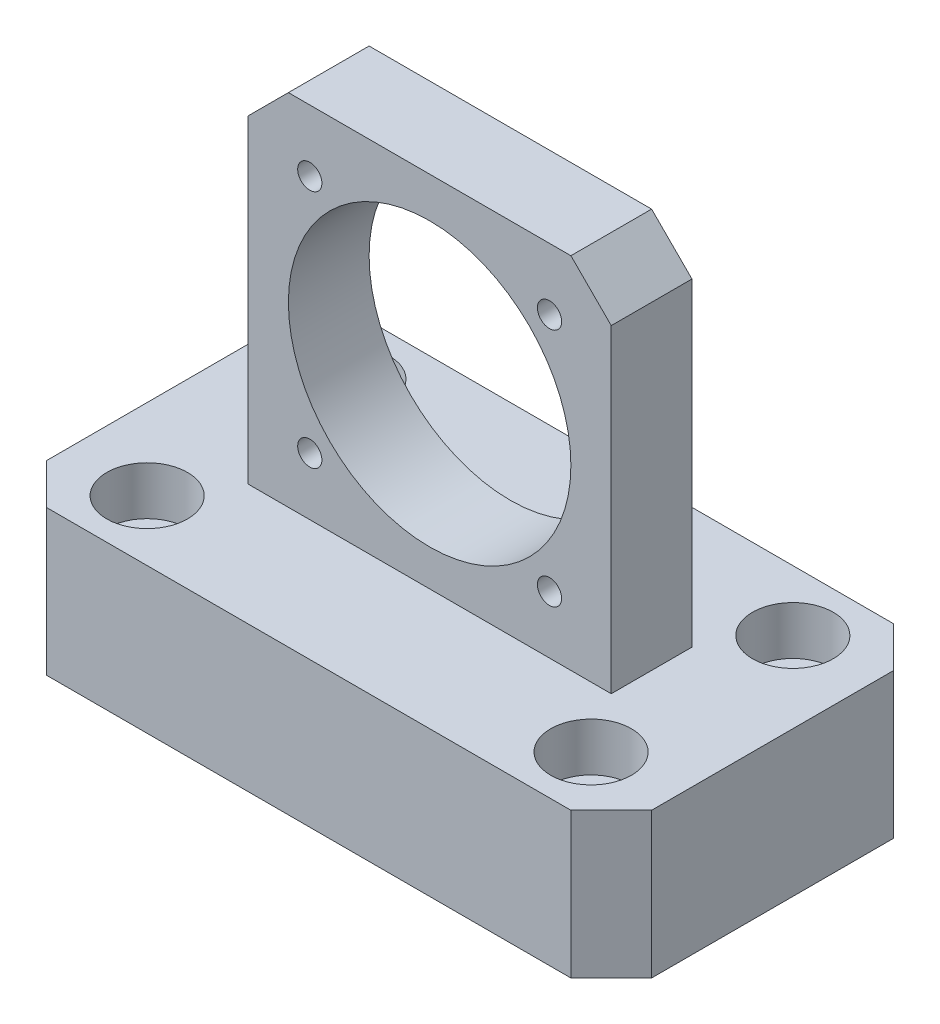
ISO-10303-21;
HEADER;
FILE_DESCRIPTION(('STEP AP214'),'2;1');
FILE_NAME('part.step','',(''),(''),'','','');
FILE_SCHEMA(('AUTOMOTIVE_DESIGN { 1 0 10303 214 1 1 1 1 }'));
ENDSEC;
DATA;
#1=APPLICATION_CONTEXT('core data for automotive mechanical design processes');
#2=APPLICATION_PROTOCOL_DEFINITION('international standard','automotive_design',2000,#1);
#3=PRODUCT_CONTEXT('',#1,'mechanical');
#4=PRODUCT('Part','Part','',(#3));
#5=PRODUCT_RELATED_PRODUCT_CATEGORY('part','',(#4));
#6=PRODUCT_DEFINITION_FORMATION('','',#4);
#7=PRODUCT_DEFINITION_CONTEXT('part definition',#1,'design');
#8=PRODUCT_DEFINITION('design','',#6,#7);
#9=PRODUCT_DEFINITION_SHAPE('','',#8);
#10=(LENGTH_UNIT() NAMED_UNIT(*) SI_UNIT(.MILLI.,.METRE.));
#11=(NAMED_UNIT(*) PLANE_ANGLE_UNIT() SI_UNIT($,.RADIAN.));
#12=(NAMED_UNIT(*) SI_UNIT($,.STERADIAN.) SOLID_ANGLE_UNIT());
#13=UNCERTAINTY_MEASURE_WITH_UNIT(LENGTH_MEASURE(1.E-05),#10,'distance_accuracy_value','');
#14=(GEOMETRIC_REPRESENTATION_CONTEXT(3) GLOBAL_UNCERTAINTY_ASSIGNED_CONTEXT((#13)) GLOBAL_UNIT_ASSIGNED_CONTEXT((#10,
#11,#12)) REPRESENTATION_CONTEXT('',''));
#15=CARTESIAN_POINT('',(0.,0.,0.));
#16=DIRECTION('',(0.,0.,1.));
#17=DIRECTION('',(1.,0.,0.));
#18=AXIS2_PLACEMENT_3D('',#15,#16,#17);
#19=CARTESIAN_POINT('',(0.,18.,0.));
#20=DIRECTION('',(0.,-1.,0.));
#21=DIRECTION('',(0.,0.,-1.));
#22=AXIS2_PLACEMENT_3D('',#19,#20,#21);
#23=PLANE('',#22);
#24=CARTESIAN_POINT('',(65.,18.,-32.5));
#25=DIRECTION('',(0.,1.,0.));
#26=DIRECTION('',(0.,0.,1.));
#27=AXIS2_PLACEMENT_3D('',#24,#25,#26);
#28=CIRCLE('',#27,5.00000000000001);
#29=CARTESIAN_POINT('',(65.,18.,-27.5));
#30=VERTEX_POINT('',#29);
#31=EDGE_CURVE('E570',#30,#30,#28,.T.);
#32=ORIENTED_EDGE('',*,*,#31,.F.);
#33=EDGE_LOOP('',(#32));
#34=FACE_BOUND('',#33,.T.);
#35=CARTESIAN_POINT('',(65.,18.,-7.5));
#36=DIRECTION('',(0.,1.,0.));
#37=DIRECTION('',(0.,0.,1.));
#38=AXIS2_PLACEMENT_3D('',#35,#36,#37);
#39=CIRCLE('',#38,5.);
#40=CARTESIAN_POINT('',(65.,18.,-2.5));
#41=VERTEX_POINT('',#40);
#42=EDGE_CURVE('E562',#41,#41,#39,.T.);
#43=ORIENTED_EDGE('',*,*,#42,.F.);
#44=EDGE_LOOP('',(#43));
#45=FACE_BOUND('',#44,.T.);
#46=CARTESIAN_POINT('',(10.,18.,-7.5));
#47=DIRECTION('',(0.,1.,0.));
#48=DIRECTION('',(0.,0.,1.));
#49=AXIS2_PLACEMENT_3D('',#46,#47,#48);
#50=CIRCLE('',#49,5.);
#51=CARTESIAN_POINT('',(10.,18.,-2.5));
#52=VERTEX_POINT('',#51);
#53=EDGE_CURVE('E553',#52,#52,#50,.T.);
#54=ORIENTED_EDGE('',*,*,#53,.F.);
#55=EDGE_LOOP('',(#54));
#56=FACE_BOUND('',#55,.T.);
#57=CARTESIAN_POINT('',(10.,18.,-32.5));
#58=DIRECTION('',(0.,1.,0.));
#59=DIRECTION('',(0.,0.,1.));
#60=AXIS2_PLACEMENT_3D('',#57,#58,#59);
#61=CIRCLE('',#60,5.);
#62=CARTESIAN_POINT('',(10.,18.,-27.5));
#63=VERTEX_POINT('',#62);
#64=EDGE_CURVE('E557',#63,#63,#61,.T.);
#65=ORIENTED_EDGE('',*,*,#64,.F.);
#66=EDGE_LOOP('',(#65));
#67=FACE_BOUND('',#66,.T.);
#68=DIRECTION('',(-1.,0.,0.));
#69=VECTOR('',#68,1.);
#70=CARTESIAN_POINT('',(0.,18.,-40.));
#71=LINE('',#70,#69);
#72=CARTESIAN_POINT('',(70.,18.,-40.));
#73=VERTEX_POINT('',#72);
#74=CARTESIAN_POINT('',(5.00000000000002,18.,-40.));
#75=VERTEX_POINT('',#74);
#76=EDGE_CURVE('E209',#73,#75,#71,.T.);
#77=ORIENTED_EDGE('',*,*,#76,.T.);
#78=DIRECTION('',(0.70710678118655,0.,-0.707106781186546));
#79=VECTOR('',#78,1.);
#80=CARTESIAN_POINT('',(0.,18.,-35.));
#81=LINE('',#80,#79);
#82=CARTESIAN_POINT('',(0.,18.,-35.));
#83=VERTEX_POINT('',#82);
#84=EDGE_CURVE('E262',#75,#83,#81,.F.);
#85=ORIENTED_EDGE('',*,*,#84,.T.);
#86=DIRECTION('',(0.,0.,1.));
#87=VECTOR('',#86,1.);
#88=CARTESIAN_POINT('',(0.,18.,0.));
#89=LINE('',#88,#87);
#90=CARTESIAN_POINT('',(0.,18.,-5.00000000000002));
#91=VERTEX_POINT('',#90);
#92=EDGE_CURVE('E196',#83,#91,#89,.T.);
#93=ORIENTED_EDGE('',*,*,#92,.T.);
#94=DIRECTION('',(-0.707106781186546,0.,-0.70710678118655));
#95=VECTOR('',#94,1.);
#96=CARTESIAN_POINT('',(5.,18.,0.));
#97=LINE('',#96,#95);
#98=CARTESIAN_POINT('',(5.,18.,0.));
#99=VERTEX_POINT('',#98);
#100=EDGE_CURVE('E256',#91,#99,#97,.F.);
#101=ORIENTED_EDGE('',*,*,#100,.T.);
#102=DIRECTION('',(1.,0.,0.));
#103=VECTOR('',#102,1.);
#104=CARTESIAN_POINT('',(0.,18.,0.));
#105=LINE('',#104,#103);
#106=CARTESIAN_POINT('',(70.,18.,0.));
#107=VERTEX_POINT('',#106);
#108=EDGE_CURVE('E200',#99,#107,#105,.T.);
#109=ORIENTED_EDGE('',*,*,#108,.T.);
#110=DIRECTION('',(-0.707106781186549,0.,0.707106781186546));
#111=VECTOR('',#110,1.);
#112=CARTESIAN_POINT('',(75.,18.,-5.));
#113=LINE('',#112,#111);
#114=CARTESIAN_POINT('',(75.,18.,-5.));
#115=VERTEX_POINT('',#114);
#116=EDGE_CURVE('E253',#107,#115,#113,.F.);
#117=ORIENTED_EDGE('',*,*,#116,.T.);
#118=DIRECTION('',(0.,0.,-1.));
#119=VECTOR('',#118,1.);
#120=CARTESIAN_POINT('',(75.,18.,0.));
#121=LINE('',#120,#119);
#122=CARTESIAN_POINT('',(75.,18.,-35.));
#123=VERTEX_POINT('',#122);
#124=EDGE_CURVE('E205',#115,#123,#121,.T.);
#125=ORIENTED_EDGE('',*,*,#124,.T.);
#126=DIRECTION('',(0.707106781186547,0.,0.707106781186549));
#127=VECTOR('',#126,1.);
#128=CARTESIAN_POINT('',(70.,18.,-40.));
#129=LINE('',#128,#127);
#130=EDGE_CURVE('E259',#123,#73,#129,.F.);
#131=ORIENTED_EDGE('',*,*,#130,.T.);
#132=EDGE_LOOP('',(#77,#85,#93,#101,#109,#117,#125,#131));
#133=FACE_BOUND('',#132,.T.);
#134=DIRECTION('',(0.,0.,1.));
#135=VECTOR('',#134,1.);
#136=CARTESIAN_POINT('',(15.,18.,-25.));
#137=LINE('',#136,#135);
#138=CARTESIAN_POINT('',(15.,18.,-25.));
#139=VERTEX_POINT('',#138);
#140=CARTESIAN_POINT('',(15.,18.,-15.));
#141=VERTEX_POINT('',#140);
#142=EDGE_CURVE('E177',#139,#141,#137,.T.);
#143=ORIENTED_EDGE('',*,*,#142,.F.);
#144=DIRECTION('',(-1.,0.,0.));
#145=VECTOR('',#144,1.);
#146=CARTESIAN_POINT('',(15.,18.,-25.));
#147=LINE('',#146,#145);
#148=CARTESIAN_POINT('',(60.,18.,-25.));
#149=VERTEX_POINT('',#148);
#150=EDGE_CURVE('E171',#149,#139,#147,.T.);
#151=ORIENTED_EDGE('',*,*,#150,.F.);
#152=DIRECTION('',(0.,0.,-1.));
#153=VECTOR('',#152,1.);
#154=CARTESIAN_POINT('',(60.,18.,-25.));
#155=LINE('',#154,#153);
#156=CARTESIAN_POINT('',(60.,18.,-15.));
#157=VERTEX_POINT('',#156);
#158=EDGE_CURVE('E155',#157,#149,#155,.T.);
#159=ORIENTED_EDGE('',*,*,#158,.F.);
#160=DIRECTION('',(1.,0.,0.));
#161=VECTOR('',#160,1.);
#162=CARTESIAN_POINT('',(15.,18.,-15.));
#163=LINE('',#162,#161);
#164=EDGE_CURVE('E168',#141,#157,#163,.T.);
#165=ORIENTED_EDGE('',*,*,#164,.F.);
#166=EDGE_LOOP('',(#143,#151,#159,#165));
#167=FACE_BOUND('',#166,.T.);
#168=ADVANCED_FACE('F47',(#34,#45,#56,#67,#133,#167),#23,.F.);
#169=CARTESIAN_POINT('',(0.,18.,0.));
#170=DIRECTION('',(1.,0.,0.));
#171=DIRECTION('',(0.,0.,-1.));
#172=AXIS2_PLACEMENT_3D('',#169,#170,#171);
#173=PLANE('',#172);
#174=ORIENTED_EDGE('',*,*,#92,.F.);
#175=DIRECTION('',(0.,-1.,0.));
#176=VECTOR('',#175,1.);
#177=CARTESIAN_POINT('',(0.,18.,-35.));
#178=LINE('',#177,#176);
#179=CARTESIAN_POINT('',(0.,0.,-35.));
#180=VERTEX_POINT('',#179);
#181=EDGE_CURVE('E230',#83,#180,#178,.T.);
#182=ORIENTED_EDGE('',*,*,#181,.T.);
#183=DIRECTION('',(0.,0.,1.));
#184=VECTOR('',#183,1.);
#185=CARTESIAN_POINT('',(0.,0.,0.));
#186=LINE('',#185,#184);
#187=CARTESIAN_POINT('',(0.,0.,-5.00000000000002));
#188=VERTEX_POINT('',#187);
#189=EDGE_CURVE('E195',#180,#188,#186,.T.);
#190=ORIENTED_EDGE('',*,*,#189,.T.);
#191=DIRECTION('',(0.,1.,0.));
#192=VECTOR('',#191,1.);
#193=CARTESIAN_POINT('',(0.,18.,-5.00000000000002));
#194=LINE('',#193,#192);
#195=EDGE_CURVE('E213',#188,#91,#194,.T.);
#196=ORIENTED_EDGE('',*,*,#195,.T.);
#197=EDGE_LOOP('',(#174,#182,#190,#196));
#198=FACE_BOUND('',#197,.T.);
#199=ADVANCED_FACE('F351',(#198),#173,.F.);
#200=CARTESIAN_POINT('',(0.,18.,0.));
#201=DIRECTION('',(0.,0.,-1.));
#202=DIRECTION('',(-1.,0.,0.));
#203=AXIS2_PLACEMENT_3D('',#200,#201,#202);
#204=PLANE('',#203);
#205=ORIENTED_EDGE('',*,*,#108,.F.);
#206=DIRECTION('',(0.,-1.,0.));
#207=VECTOR('',#206,1.);
#208=CARTESIAN_POINT('',(5.,18.,0.));
#209=LINE('',#208,#207);
#210=CARTESIAN_POINT('',(5.,0.,0.));
#211=VERTEX_POINT('',#210);
#212=EDGE_CURVE('E275',#99,#211,#209,.T.);
#213=ORIENTED_EDGE('',*,*,#212,.T.);
#214=DIRECTION('',(1.,0.,0.));
#215=VECTOR('',#214,1.);
#216=CARTESIAN_POINT('',(0.,0.,0.));
#217=LINE('',#216,#215);
#218=CARTESIAN_POINT('',(70.,0.,0.));
#219=VERTEX_POINT('',#218);
#220=EDGE_CURVE('E217',#211,#219,#217,.T.);
#221=ORIENTED_EDGE('',*,*,#220,.T.);
#222=DIRECTION('',(0.,1.,0.));
#223=VECTOR('',#222,1.);
#224=CARTESIAN_POINT('',(70.,18.,0.));
#225=LINE('',#224,#223);
#226=EDGE_CURVE('E272',#219,#107,#225,.T.);
#227=ORIENTED_EDGE('',*,*,#226,.T.);
#228=EDGE_LOOP('',(#205,#213,#221,#227));
#229=FACE_BOUND('',#228,.T.);
#230=ADVANCED_FACE('F359',(#229),#204,.F.);
#231=CARTESIAN_POINT('',(75.,18.,0.));
#232=DIRECTION('',(-1.,0.,0.));
#233=DIRECTION('',(0.,0.,1.));
#234=AXIS2_PLACEMENT_3D('',#231,#232,#233);
#235=PLANE('',#234);
#236=DIRECTION('',(0.,0.,-1.));
#237=VECTOR('',#236,1.);
#238=CARTESIAN_POINT('',(75.,0.,0.));
#239=LINE('',#238,#237);
#240=CARTESIAN_POINT('',(75.,0.,-5.));
#241=VERTEX_POINT('',#240);
#242=CARTESIAN_POINT('',(75.,0.,-35.));
#243=VERTEX_POINT('',#242);
#244=EDGE_CURVE('E221',#241,#243,#239,.T.);
#245=ORIENTED_EDGE('',*,*,#244,.T.);
#246=DIRECTION('',(0.,1.,0.));
#247=VECTOR('',#246,1.);
#248=CARTESIAN_POINT('',(75.,18.,-35.));
#249=LINE('',#248,#247);
#250=EDGE_CURVE('E269',#243,#123,#249,.T.);
#251=ORIENTED_EDGE('',*,*,#250,.T.);
#252=ORIENTED_EDGE('',*,*,#124,.F.);
#253=DIRECTION('',(0.,-1.,0.));
#254=VECTOR('',#253,1.);
#255=CARTESIAN_POINT('',(75.,18.,-5.));
#256=LINE('',#255,#254);
#257=EDGE_CURVE('E265',#115,#241,#256,.T.);
#258=ORIENTED_EDGE('',*,*,#257,.T.);
#259=EDGE_LOOP('',(#245,#251,#252,#258));
#260=FACE_BOUND('',#259,.T.);
#261=ADVANCED_FACE('F375',(#260),#235,.F.);
#262=CARTESIAN_POINT('',(0.,18.,-40.));
#263=DIRECTION('',(0.,0.,1.));
#264=DIRECTION('',(1.,0.,0.));
#265=AXIS2_PLACEMENT_3D('',#262,#263,#264);
#266=PLANE('',#265);
#267=DIRECTION('',(-1.,0.,0.));
#268=VECTOR('',#267,1.);
#269=CARTESIAN_POINT('',(0.,0.,-40.));
#270=LINE('',#269,#268);
#271=CARTESIAN_POINT('',(70.,0.,-40.));
#272=VERTEX_POINT('',#271);
#273=CARTESIAN_POINT('',(5.00000000000002,0.,-40.));
#274=VERTEX_POINT('',#273);
#275=EDGE_CURVE('E201',#272,#274,#270,.T.);
#276=ORIENTED_EDGE('',*,*,#275,.T.);
#277=DIRECTION('',(0.,1.,0.));
#278=VECTOR('',#277,1.);
#279=CARTESIAN_POINT('',(5.00000000000002,18.,-40.));
#280=LINE('',#279,#278);
#281=EDGE_CURVE('E250',#274,#75,#280,.T.);
#282=ORIENTED_EDGE('',*,*,#281,.T.);
#283=ORIENTED_EDGE('',*,*,#76,.F.);
#284=DIRECTION('',(0.,-1.,0.));
#285=VECTOR('',#284,1.);
#286=CARTESIAN_POINT('',(70.,18.,-40.));
#287=LINE('',#286,#285);
#288=EDGE_CURVE('E246',#73,#272,#287,.T.);
#289=ORIENTED_EDGE('',*,*,#288,.T.);
#290=EDGE_LOOP('',(#276,#282,#283,#289));
#291=FACE_BOUND('',#290,.T.);
#292=ADVANCED_FACE('F371',(#291),#266,.F.);
#293=CARTESIAN_POINT('',(0.,0.,0.));
#294=DIRECTION('',(0.,-1.,0.));
#295=DIRECTION('',(0.,0.,-1.));
#296=AXIS2_PLACEMENT_3D('',#293,#294,#295);
#297=PLANE('',#296);
#298=CARTESIAN_POINT('',(65.,0.,-7.5));
#299=DIRECTION('',(0.,1.,0.));
#300=DIRECTION('',(0.,0.,1.));
#301=AXIS2_PLACEMENT_3D('',#298,#299,#300);
#302=CIRCLE('',#301,2.75000000000001);
#303=CARTESIAN_POINT('',(65.,0.,-4.74999999999999));
#304=VERTEX_POINT('',#303);
#305=EDGE_CURVE('E545',#304,#304,#302,.T.);
#306=ORIENTED_EDGE('',*,*,#305,.T.);
#307=EDGE_LOOP('',(#306));
#308=FACE_BOUND('',#307,.T.);
#309=CARTESIAN_POINT('',(65.,0.,-32.5));
#310=DIRECTION('',(0.,1.,0.));
#311=DIRECTION('',(0.,0.,1.));
#312=AXIS2_PLACEMENT_3D('',#309,#310,#311);
#313=CIRCLE('',#312,2.75000000000001);
#314=CARTESIAN_POINT('',(65.,0.,-29.75));
#315=VERTEX_POINT('',#314);
#316=EDGE_CURVE('E537',#315,#315,#313,.T.);
#317=ORIENTED_EDGE('',*,*,#316,.T.);
#318=EDGE_LOOP('',(#317));
#319=FACE_BOUND('',#318,.T.);
#320=CARTESIAN_POINT('',(10.,0.,-32.5));
#321=DIRECTION('',(0.,1.,0.));
#322=DIRECTION('',(0.,0.,1.));
#323=AXIS2_PLACEMENT_3D('',#320,#321,#322);
#324=CIRCLE('',#323,2.75);
#325=CARTESIAN_POINT('',(10.,0.,-29.75));
#326=VERTEX_POINT('',#325);
#327=EDGE_CURVE('E519',#326,#326,#324,.T.);
#328=ORIENTED_EDGE('',*,*,#327,.T.);
#329=EDGE_LOOP('',(#328));
#330=FACE_BOUND('',#329,.T.);
#331=CARTESIAN_POINT('',(10.,0.,-7.5));
#332=DIRECTION('',(0.,1.,0.));
#333=DIRECTION('',(0.,0.,1.));
#334=AXIS2_PLACEMENT_3D('',#331,#332,#333);
#335=CIRCLE('',#334,2.75);
#336=CARTESIAN_POINT('',(10.,0.,-4.75));
#337=VERTEX_POINT('',#336);
#338=EDGE_CURVE('E529',#337,#337,#335,.T.);
#339=ORIENTED_EDGE('',*,*,#338,.T.);
#340=EDGE_LOOP('',(#339));
#341=FACE_BOUND('',#340,.T.);
#342=ORIENTED_EDGE('',*,*,#189,.F.);
#343=DIRECTION('',(-0.70710678118655,0.,0.707106781186546));
#344=VECTOR('',#343,1.);
#345=CARTESIAN_POINT('',(-17.5,0.,-17.5000000000001));
#346=LINE('',#345,#344);
#347=EDGE_CURVE('E243',#180,#274,#346,.F.);
#348=ORIENTED_EDGE('',*,*,#347,.T.);
#349=ORIENTED_EDGE('',*,*,#275,.F.);
#350=DIRECTION('',(-0.707106781186547,0.,-0.707106781186549));
#351=VECTOR('',#350,1.);
#352=CARTESIAN_POINT('',(55.0000000000001,0.,-54.9999999999999));
#353=LINE('',#352,#351);
#354=EDGE_CURVE('E240',#272,#243,#353,.F.);
#355=ORIENTED_EDGE('',*,*,#354,.T.);
#356=ORIENTED_EDGE('',*,*,#244,.F.);
#357=DIRECTION('',(0.707106781186549,0.,-0.707106781186546));
#358=VECTOR('',#357,1.);
#359=CARTESIAN_POINT('',(34.9999999999998,0.,35.));
#360=LINE('',#359,#358);
#361=EDGE_CURVE('E234',#241,#219,#360,.F.);
#362=ORIENTED_EDGE('',*,*,#361,.T.);
#363=ORIENTED_EDGE('',*,*,#220,.F.);
#364=DIRECTION('',(0.707106781186546,0.,0.70710678118655));
#365=VECTOR('',#364,1.);
#366=CARTESIAN_POINT('',(2.50000000000001,0.,-2.5));
#367=LINE('',#366,#365);
#368=EDGE_CURVE('E237',#211,#188,#367,.F.);
#369=ORIENTED_EDGE('',*,*,#368,.T.);
#370=EDGE_LOOP('',(#342,#348,#349,#355,#356,#362,#363,#369));
#371=FACE_BOUND('',#370,.T.);
#372=ADVANCED_FACE('F367',(#308,#319,#330,#341,#371),#297,.T.);
#373=CARTESIAN_POINT('',(0.,18.,-35.));
#374=DIRECTION('',(0.707106781186546,0.,0.70710678118655));
#375=DIRECTION('',(0.,-1.,0.));
#376=AXIS2_PLACEMENT_3D('',#373,#374,#375);
#377=PLANE('',#376);
#378=ORIENTED_EDGE('',*,*,#84,.F.);
#379=ORIENTED_EDGE('',*,*,#281,.F.);
#380=ORIENTED_EDGE('',*,*,#347,.F.);
#381=ORIENTED_EDGE('',*,*,#181,.F.);
#382=EDGE_LOOP('',(#378,#379,#380,#381));
#383=FACE_BOUND('',#382,.T.);
#384=ADVANCED_FACE('F370',(#383),#377,.F.);
#385=CARTESIAN_POINT('',(70.,18.,-40.));
#386=DIRECTION('',(-0.707106781186549,0.,0.707106781186547));
#387=DIRECTION('',(0.,-1.,0.));
#388=AXIS2_PLACEMENT_3D('',#385,#386,#387);
#389=PLANE('',#388);
#390=ORIENTED_EDGE('',*,*,#130,.F.);
#391=ORIENTED_EDGE('',*,*,#250,.F.);
#392=ORIENTED_EDGE('',*,*,#354,.F.);
#393=ORIENTED_EDGE('',*,*,#288,.F.);
#394=EDGE_LOOP('',(#390,#391,#392,#393));
#395=FACE_BOUND('',#394,.T.);
#396=ADVANCED_FACE('F389',(#395),#389,.F.);
#397=CARTESIAN_POINT('',(5.,18.,0.));
#398=DIRECTION('',(0.70710678118655,0.,-0.707106781186546));
#399=DIRECTION('',(0.,-1.,0.));
#400=AXIS2_PLACEMENT_3D('',#397,#398,#399);
#401=PLANE('',#400);
#402=ORIENTED_EDGE('',*,*,#100,.F.);
#403=ORIENTED_EDGE('',*,*,#195,.F.);
#404=ORIENTED_EDGE('',*,*,#368,.F.);
#405=ORIENTED_EDGE('',*,*,#212,.F.);
#406=EDGE_LOOP('',(#402,#403,#404,#405));
#407=FACE_BOUND('',#406,.T.);
#408=ADVANCED_FACE('F396',(#407),#401,.F.);
#409=CARTESIAN_POINT('',(75.,18.,-5.));
#410=DIRECTION('',(-0.707106781186546,0.,-0.707106781186549));
#411=DIRECTION('',(0.,-1.,0.));
#412=AXIS2_PLACEMENT_3D('',#409,#410,#411);
#413=PLANE('',#412);
#414=ORIENTED_EDGE('',*,*,#116,.F.);
#415=ORIENTED_EDGE('',*,*,#226,.F.);
#416=ORIENTED_EDGE('',*,*,#361,.F.);
#417=ORIENTED_EDGE('',*,*,#257,.F.);
#418=EDGE_LOOP('',(#414,#415,#416,#417));
#419=FACE_BOUND('',#418,.T.);
#420=ADVANCED_FACE('F403',(#419),#413,.F.);
#421=CARTESIAN_POINT('',(15.,62.5,-25.));
#422=DIRECTION('',(1.,0.,0.));
#423=DIRECTION('',(0.,0.,-1.));
#424=AXIS2_PLACEMENT_3D('',#421,#422,#423);
#425=PLANE('',#424);
#426=DIRECTION('',(0.,-1.,0.));
#427=VECTOR('',#426,1.);
#428=CARTESIAN_POINT('',(15.,62.5,-15.));
#429=LINE('',#428,#427);
#430=CARTESIAN_POINT('',(15.,57.5,-15.));
#431=VERTEX_POINT('',#430);
#432=EDGE_CURVE('E161',#431,#141,#429,.T.);
#433=ORIENTED_EDGE('',*,*,#432,.F.);
#434=DIRECTION('',(0.,0.,-1.));
#435=VECTOR('',#434,1.);
#436=CARTESIAN_POINT('',(15.,57.5,-25.));
#437=LINE('',#436,#435);
#438=CARTESIAN_POINT('',(15.,57.5,-25.));
#439=VERTEX_POINT('',#438);
#440=EDGE_CURVE('E74',#431,#439,#437,.T.);
#441=ORIENTED_EDGE('',*,*,#440,.T.);
#442=DIRECTION('',(0.,-1.,0.));
#443=VECTOR('',#442,1.);
#444=CARTESIAN_POINT('',(15.,62.5,-25.));
#445=LINE('',#444,#443);
#446=EDGE_CURVE('E187',#439,#139,#445,.T.);
#447=ORIENTED_EDGE('',*,*,#446,.T.);
#448=ORIENTED_EDGE('',*,*,#142,.T.);
#449=EDGE_LOOP('',(#433,#441,#447,#448));
#450=FACE_BOUND('',#449,.T.);
#451=ADVANCED_FACE('F339',(#450),#425,.F.);
#452=CARTESIAN_POINT('',(15.,62.5,-15.));
#453=DIRECTION('',(0.,0.,-1.));
#454=DIRECTION('',(-1.,0.,0.));
#455=AXIS2_PLACEMENT_3D('',#452,#453,#454);
#456=PLANE('',#455);
#457=CARTESIAN_POINT('',(22.65,25.15,-15.));
#458=DIRECTION('',(0.,0.,1.));
#459=DIRECTION('',(1.,0.,0.));
#460=AXIS2_PLACEMENT_3D('',#457,#458,#459);
#461=CIRCLE('',#460,1.5);
#462=CARTESIAN_POINT('',(24.15,25.15,-15.));
#463=VERTEX_POINT('',#462);
#464=EDGE_CURVE('E581',#463,#463,#461,.T.);
#465=ORIENTED_EDGE('',*,*,#464,.F.);
#466=EDGE_LOOP('',(#465));
#467=FACE_BOUND('',#466,.T.);
#468=CARTESIAN_POINT('',(52.35,25.15,-15.));
#469=DIRECTION('',(0.,0.,1.));
#470=DIRECTION('',(1.,0.,0.));
#471=AXIS2_PLACEMENT_3D('',#468,#469,#470);
#472=CIRCLE('',#471,1.5);
#473=CARTESIAN_POINT('',(53.85,25.15,-15.));
#474=VERTEX_POINT('',#473);
#475=EDGE_CURVE('E589',#474,#474,#472,.T.);
#476=ORIENTED_EDGE('',*,*,#475,.F.);
#477=EDGE_LOOP('',(#476));
#478=FACE_BOUND('',#477,.T.);
#479=CARTESIAN_POINT('',(52.35,54.85,-15.));
#480=DIRECTION('',(0.,0.,1.));
#481=DIRECTION('',(1.,0.,0.));
#482=AXIS2_PLACEMENT_3D('',#479,#480,#481);
#483=CIRCLE('',#482,1.5);
#484=CARTESIAN_POINT('',(53.85,54.85,-15.));
#485=VERTEX_POINT('',#484);
#486=EDGE_CURVE('E585',#485,#485,#483,.T.);
#487=ORIENTED_EDGE('',*,*,#486,.F.);
#488=EDGE_LOOP('',(#487));
#489=FACE_BOUND('',#488,.T.);
#490=CARTESIAN_POINT('',(22.65,54.85,-15.));
#491=DIRECTION('',(0.,0.,1.));
#492=DIRECTION('',(1.,0.,0.));
#493=AXIS2_PLACEMENT_3D('',#490,#491,#492);
#494=CIRCLE('',#493,1.5);
#495=CARTESIAN_POINT('',(24.15,54.85,-15.));
#496=VERTEX_POINT('',#495);
#497=EDGE_CURVE('E308',#496,#496,#494,.T.);
#498=ORIENTED_EDGE('',*,*,#497,.F.);
#499=EDGE_LOOP('',(#498));
#500=FACE_BOUND('',#499,.T.);
#501=CARTESIAN_POINT('',(37.5,40.,-15.));
#502=DIRECTION('',(0.,0.,1.));
#503=DIRECTION('',(1.,0.,0.));
#504=AXIS2_PLACEMENT_3D('',#501,#502,#503);
#505=CIRCLE('',#504,17.5);
#506=CARTESIAN_POINT('',(55.,40.,-15.));
#507=VERTEX_POINT('',#506);
#508=EDGE_CURVE('E302',#507,#507,#505,.T.);
#509=ORIENTED_EDGE('',*,*,#508,.F.);
#510=EDGE_LOOP('',(#509));
#511=FACE_BOUND('',#510,.T.);
#512=DIRECTION('',(1.,0.,0.));
#513=VECTOR('',#512,1.);
#514=CARTESIAN_POINT('',(15.,62.5,-15.));
#515=LINE('',#514,#513);
#516=CARTESIAN_POINT('',(20.,62.5,-15.));
#517=VERTEX_POINT('',#516);
#518=CARTESIAN_POINT('',(55.,62.5,-15.));
#519=VERTEX_POINT('',#518);
#520=EDGE_CURVE('E186',#517,#519,#515,.T.);
#521=ORIENTED_EDGE('',*,*,#520,.F.);
#522=DIRECTION('',(-0.707106781186546,-0.707106781186549,0.));
#523=VECTOR('',#522,1.);
#524=CARTESIAN_POINT('',(20.,62.5,-15.));
#525=LINE('',#524,#523);
#526=EDGE_CURVE('E290',#517,#431,#525,.T.);
#527=ORIENTED_EDGE('',*,*,#526,.T.);
#528=ORIENTED_EDGE('',*,*,#432,.T.);
#529=ORIENTED_EDGE('',*,*,#164,.T.);
#530=DIRECTION('',(0.,-1.,0.));
#531=VECTOR('',#530,1.);
#532=CARTESIAN_POINT('',(60.,62.5,-15.));
#533=LINE('',#532,#531);
#534=CARTESIAN_POINT('',(60.,57.5,-15.));
#535=VERTEX_POINT('',#534);
#536=EDGE_CURVE('E152',#535,#157,#533,.T.);
#537=ORIENTED_EDGE('',*,*,#536,.F.);
#538=DIRECTION('',(-0.707106781186546,0.707106781186549,0.));
#539=VECTOR('',#538,1.);
#540=CARTESIAN_POINT('',(55.,62.5,-15.));
#541=LINE('',#540,#539);
#542=EDGE_CURVE('E287',#535,#519,#541,.T.);
#543=ORIENTED_EDGE('',*,*,#542,.T.);
#544=EDGE_LOOP('',(#521,#527,#528,#529,#537,#543));
#545=FACE_BOUND('',#544,.T.);
#546=ADVANCED_FACE('F175',(#467,#478,#489,#500,#511,#545),#456,.F.);
#547=CARTESIAN_POINT('',(60.,62.5,-25.));
#548=DIRECTION('',(-1.,0.,0.));
#549=DIRECTION('',(0.,0.,1.));
#550=AXIS2_PLACEMENT_3D('',#547,#548,#549);
#551=PLANE('',#550);
#552=DIRECTION('',(0.,-1.,0.));
#553=VECTOR('',#552,1.);
#554=CARTESIAN_POINT('',(60.,62.5,-25.));
#555=LINE('',#554,#553);
#556=CARTESIAN_POINT('',(60.,57.5,-25.));
#557=VERTEX_POINT('',#556);
#558=EDGE_CURVE('E162',#557,#149,#555,.T.);
#559=ORIENTED_EDGE('',*,*,#558,.F.);
#560=DIRECTION('',(0.,0.,1.));
#561=VECTOR('',#560,1.);
#562=CARTESIAN_POINT('',(60.,57.5,-15.));
#563=LINE('',#562,#561);
#564=EDGE_CURVE('E11',#557,#535,#563,.T.);
#565=ORIENTED_EDGE('',*,*,#564,.T.);
#566=ORIENTED_EDGE('',*,*,#536,.T.);
#567=ORIENTED_EDGE('',*,*,#158,.T.);
#568=EDGE_LOOP('',(#559,#565,#566,#567));
#569=FACE_BOUND('',#568,.T.);
#570=ADVANCED_FACE('F154',(#569),#551,.F.);
#571=CARTESIAN_POINT('',(15.,62.5,-25.));
#572=DIRECTION('',(0.,0.,1.));
#573=DIRECTION('',(1.,0.,0.));
#574=AXIS2_PLACEMENT_3D('',#571,#572,#573);
#575=PLANE('',#574);
#576=CARTESIAN_POINT('',(22.65,25.15,-25.));
#577=DIRECTION('',(0.,0.,1.));
#578=DIRECTION('',(1.,0.,0.));
#579=AXIS2_PLACEMENT_3D('',#576,#577,#578);
#580=CIRCLE('',#579,1.5);
#581=CARTESIAN_POINT('',(24.15,25.15,-25.));
#582=VERTEX_POINT('',#581);
#583=EDGE_CURVE('E52',#582,#582,#580,.T.);
#584=ORIENTED_EDGE('',*,*,#583,.T.);
#585=EDGE_LOOP('',(#584));
#586=FACE_BOUND('',#585,.T.);
#587=CARTESIAN_POINT('',(52.35,25.15,-25.));
#588=DIRECTION('',(0.,0.,1.));
#589=DIRECTION('',(1.,0.,0.));
#590=AXIS2_PLACEMENT_3D('',#587,#588,#589);
#591=CIRCLE('',#590,1.5);
#592=CARTESIAN_POINT('',(53.85,25.15,-25.));
#593=VERTEX_POINT('',#592);
#594=EDGE_CURVE('E311',#593,#593,#591,.T.);
#595=ORIENTED_EDGE('',*,*,#594,.T.);
#596=EDGE_LOOP('',(#595));
#597=FACE_BOUND('',#596,.T.);
#598=CARTESIAN_POINT('',(52.35,54.85,-25.));
#599=DIRECTION('',(0.,0.,1.));
#600=DIRECTION('',(1.,0.,0.));
#601=AXIS2_PLACEMENT_3D('',#598,#599,#600);
#602=CIRCLE('',#601,1.5);
#603=CARTESIAN_POINT('',(53.85,54.85,-25.));
#604=VERTEX_POINT('',#603);
#605=EDGE_CURVE('E307',#604,#604,#602,.T.);
#606=ORIENTED_EDGE('',*,*,#605,.T.);
#607=EDGE_LOOP('',(#606));
#608=FACE_BOUND('',#607,.T.);
#609=CARTESIAN_POINT('',(22.65,54.85,-25.));
#610=DIRECTION('',(0.,0.,1.));
#611=DIRECTION('',(1.,0.,0.));
#612=AXIS2_PLACEMENT_3D('',#609,#610,#611);
#613=CIRCLE('',#612,1.5);
#614=CARTESIAN_POINT('',(24.15,54.85,-25.));
#615=VERTEX_POINT('',#614);
#616=EDGE_CURVE('E303',#615,#615,#613,.T.);
#617=ORIENTED_EDGE('',*,*,#616,.T.);
#618=EDGE_LOOP('',(#617));
#619=FACE_BOUND('',#618,.T.);
#620=CARTESIAN_POINT('',(37.5,40.,-25.));
#621=DIRECTION('',(0.,0.,1.));
#622=DIRECTION('',(1.,0.,0.));
#623=AXIS2_PLACEMENT_3D('',#620,#621,#622);
#624=CIRCLE('',#623,17.5);
#625=CARTESIAN_POINT('',(55.,40.,-25.));
#626=VERTEX_POINT('',#625);
#627=EDGE_CURVE('E180',#626,#626,#624,.T.);
#628=ORIENTED_EDGE('',*,*,#627,.T.);
#629=EDGE_LOOP('',(#628));
#630=FACE_BOUND('',#629,.T.);
#631=ORIENTED_EDGE('',*,*,#446,.F.);
#632=DIRECTION('',(0.707106781186546,0.707106781186549,0.));
#633=VECTOR('',#632,1.);
#634=CARTESIAN_POINT('',(20.,62.5,-25.));
#635=LINE('',#634,#633);
#636=CARTESIAN_POINT('',(20.,62.5,-25.));
#637=VERTEX_POINT('',#636);
#638=EDGE_CURVE('E58',#439,#637,#635,.T.);
#639=ORIENTED_EDGE('',*,*,#638,.T.);
#640=DIRECTION('',(-1.,0.,0.));
#641=VECTOR('',#640,1.);
#642=CARTESIAN_POINT('',(15.,62.5,-25.));
#643=LINE('',#642,#641);
#644=CARTESIAN_POINT('',(55.,62.5,-25.));
#645=VERTEX_POINT('',#644);
#646=EDGE_CURVE('E190',#645,#637,#643,.T.);
#647=ORIENTED_EDGE('',*,*,#646,.F.);
#648=DIRECTION('',(0.707106781186546,-0.707106781186549,0.));
#649=VECTOR('',#648,1.);
#650=CARTESIAN_POINT('',(55.,62.5,-25.));
#651=LINE('',#650,#649);
#652=EDGE_CURVE('E66',#645,#557,#651,.T.);
#653=ORIENTED_EDGE('',*,*,#652,.T.);
#654=ORIENTED_EDGE('',*,*,#558,.T.);
#655=ORIENTED_EDGE('',*,*,#150,.T.);
#656=EDGE_LOOP('',(#631,#639,#647,#653,#654,#655));
#657=FACE_BOUND('',#656,.T.);
#658=ADVANCED_FACE('F340',(#586,#597,#608,#619,#630,#657),#575,.F.);
#659=CARTESIAN_POINT('',(0.,62.5,0.));
#660=DIRECTION('',(0.,1.,0.));
#661=DIRECTION('',(0.,0.,1.));
#662=AXIS2_PLACEMENT_3D('',#659,#660,#661);
#663=PLANE('',#662);
#664=ORIENTED_EDGE('',*,*,#646,.T.);
#665=DIRECTION('',(0.,0.,1.));
#666=VECTOR('',#665,1.);
#667=CARTESIAN_POINT('',(20.,62.5,-15.));
#668=LINE('',#667,#666);
#669=EDGE_CURVE('E283',#637,#517,#668,.T.);
#670=ORIENTED_EDGE('',*,*,#669,.T.);
#671=ORIENTED_EDGE('',*,*,#520,.T.);
#672=DIRECTION('',(0.,0.,-1.));
#673=VECTOR('',#672,1.);
#674=CARTESIAN_POINT('',(55.,62.5,-25.));
#675=LINE('',#674,#673);
#676=EDGE_CURVE('E279',#519,#645,#675,.T.);
#677=ORIENTED_EDGE('',*,*,#676,.T.);
#678=EDGE_LOOP('',(#664,#670,#671,#677));
#679=FACE_BOUND('',#678,.T.);
#680=ADVANCED_FACE('F334',(#679),#663,.T.);
#681=CARTESIAN_POINT('',(20.,62.5,0.));
#682=DIRECTION('',(-0.707106781186549,0.707106781186546,0.));
#683=DIRECTION('',(0.,0.,-1.));
#684=AXIS2_PLACEMENT_3D('',#681,#682,#683);
#685=PLANE('',#684);
#686=ORIENTED_EDGE('',*,*,#638,.F.);
#687=ORIENTED_EDGE('',*,*,#440,.F.);
#688=ORIENTED_EDGE('',*,*,#526,.F.);
#689=ORIENTED_EDGE('',*,*,#669,.F.);
#690=EDGE_LOOP('',(#686,#687,#688,#689));
#691=FACE_BOUND('',#690,.T.);
#692=ADVANCED_FACE('F338',(#691),#685,.T.);
#693=CARTESIAN_POINT('',(55.,62.5,0.));
#694=DIRECTION('',(0.707106781186549,0.707106781186546,0.));
#695=DIRECTION('',(0.,0.,1.));
#696=AXIS2_PLACEMENT_3D('',#693,#694,#695);
#697=PLANE('',#696);
#698=ORIENTED_EDGE('',*,*,#542,.F.);
#699=ORIENTED_EDGE('',*,*,#564,.F.);
#700=ORIENTED_EDGE('',*,*,#652,.F.);
#701=ORIENTED_EDGE('',*,*,#676,.F.);
#702=EDGE_LOOP('',(#698,#699,#700,#701));
#703=FACE_BOUND('',#702,.T.);
#704=ADVANCED_FACE('F50',(#703),#697,.T.);
#705=CARTESIAN_POINT('',(37.5,40.,-40.));
#706=DIRECTION('',(0.,0.,1.));
#707=DIRECTION('',(1.,0.,0.));
#708=AXIS2_PLACEMENT_3D('',#705,#706,#707);
#709=CYLINDRICAL_SURFACE('',#708,17.5);
#710=ORIENTED_EDGE('',*,*,#508,.T.);
#711=EDGE_LOOP('',(#710));
#712=FACE_BOUND('',#711,.T.);
#713=ORIENTED_EDGE('',*,*,#627,.F.);
#714=EDGE_LOOP('',(#713));
#715=FACE_BOUND('',#714,.T.);
#716=ADVANCED_FACE('F343',(#712,#715),#709,.F.);
#717=CARTESIAN_POINT('',(22.65,54.85,-40.));
#718=DIRECTION('',(0.,0.,1.));
#719=DIRECTION('',(1.,0.,0.));
#720=AXIS2_PLACEMENT_3D('',#717,#718,#719);
#721=CYLINDRICAL_SURFACE('',#720,1.5);
#722=ORIENTED_EDGE('',*,*,#497,.T.);
#723=EDGE_LOOP('',(#722));
#724=FACE_BOUND('',#723,.T.);
#725=ORIENTED_EDGE('',*,*,#616,.F.);
#726=EDGE_LOOP('',(#725));
#727=FACE_BOUND('',#726,.T.);
#728=ADVANCED_FACE('F348',(#724,#727),#721,.F.);
#729=CARTESIAN_POINT('',(52.35,54.85,-40.));
#730=DIRECTION('',(0.,0.,1.));
#731=DIRECTION('',(1.,0.,0.));
#732=AXIS2_PLACEMENT_3D('',#729,#730,#731);
#733=CYLINDRICAL_SURFACE('',#732,1.5);
#734=ORIENTED_EDGE('',*,*,#486,.T.);
#735=EDGE_LOOP('',(#734));
#736=FACE_BOUND('',#735,.T.);
#737=ORIENTED_EDGE('',*,*,#605,.F.);
#738=EDGE_LOOP('',(#737));
#739=FACE_BOUND('',#738,.T.);
#740=ADVANCED_FACE('F456',(#736,#739),#733,.F.);
#741=CARTESIAN_POINT('',(52.35,25.15,-40.));
#742=DIRECTION('',(0.,0.,1.));
#743=DIRECTION('',(1.,0.,0.));
#744=AXIS2_PLACEMENT_3D('',#741,#742,#743);
#745=CYLINDRICAL_SURFACE('',#744,1.5);
#746=ORIENTED_EDGE('',*,*,#475,.T.);
#747=EDGE_LOOP('',(#746));
#748=FACE_BOUND('',#747,.T.);
#749=ORIENTED_EDGE('',*,*,#594,.F.);
#750=EDGE_LOOP('',(#749));
#751=FACE_BOUND('',#750,.T.);
#752=ADVANCED_FACE('F461',(#748,#751),#745,.F.);
#753=CARTESIAN_POINT('',(22.65,25.15,-40.));
#754=DIRECTION('',(0.,0.,1.));
#755=DIRECTION('',(1.,0.,0.));
#756=AXIS2_PLACEMENT_3D('',#753,#754,#755);
#757=CYLINDRICAL_SURFACE('',#756,1.5);
#758=ORIENTED_EDGE('',*,*,#464,.T.);
#759=EDGE_LOOP('',(#758));
#760=FACE_BOUND('',#759,.T.);
#761=ORIENTED_EDGE('',*,*,#583,.F.);
#762=EDGE_LOOP('',(#761));
#763=FACE_BOUND('',#762,.T.);
#764=ADVANCED_FACE('F458',(#760,#763),#757,.F.);
#765=CARTESIAN_POINT('',(10.,12.,-32.5));
#766=DIRECTION('',(0.,1.,0.));
#767=DIRECTION('',(0.,0.,1.));
#768=AXIS2_PLACEMENT_3D('',#765,#766,#767);
#769=CYLINDRICAL_SURFACE('',#768,5.);
#770=CARTESIAN_POINT('',(10.,12.,-32.5));
#771=DIRECTION('',(0.,1.,0.));
#772=DIRECTION('',(0.,0.,1.));
#773=AXIS2_PLACEMENT_3D('',#770,#771,#772);
#774=CIRCLE('',#773,5.);
#775=CARTESIAN_POINT('',(10.,12.,-27.5));
#776=VERTEX_POINT('',#775);
#777=EDGE_CURVE('E577',#776,#776,#774,.T.);
#778=ORIENTED_EDGE('',*,*,#777,.F.);
#779=EDGE_LOOP('',(#778));
#780=FACE_BOUND('',#779,.T.);
#781=ORIENTED_EDGE('',*,*,#64,.T.);
#782=EDGE_LOOP('',(#781));
#783=FACE_BOUND('',#782,.T.);
#784=ADVANCED_FACE('F460',(#780,#783),#769,.F.);
#785=CARTESIAN_POINT('',(10.,12.,-32.5));
#786=DIRECTION('',(0.,1.,0.));
#787=DIRECTION('',(0.,0.,1.));
#788=AXIS2_PLACEMENT_3D('',#785,#786,#787);
#789=PLANE('',#788);
#790=CARTESIAN_POINT('',(10.,12.,-32.5));
#791=DIRECTION('',(0.,1.,0.));
#792=DIRECTION('',(0.,0.,1.));
#793=AXIS2_PLACEMENT_3D('',#790,#791,#792);
#794=CIRCLE('',#793,2.75);
#795=CARTESIAN_POINT('',(10.,12.,-29.75));
#796=VERTEX_POINT('',#795);
#797=EDGE_CURVE('E522',#796,#796,#794,.T.);
#798=ORIENTED_EDGE('',*,*,#797,.F.);
#799=EDGE_LOOP('',(#798));
#800=FACE_BOUND('',#799,.T.);
#801=ORIENTED_EDGE('',*,*,#777,.T.);
#802=EDGE_LOOP('',(#801));
#803=FACE_BOUND('',#802,.T.);
#804=ADVANCED_FACE('F470',(#800,#803),#789,.T.);
#805=CARTESIAN_POINT('',(10.,12.,-7.5));
#806=DIRECTION('',(0.,1.,0.));
#807=DIRECTION('',(0.,0.,1.));
#808=AXIS2_PLACEMENT_3D('',#805,#806,#807);
#809=CYLINDRICAL_SURFACE('',#808,5.);
#810=CARTESIAN_POINT('',(10.,12.,-7.5));
#811=DIRECTION('',(0.,1.,0.));
#812=DIRECTION('',(0.,0.,1.));
#813=AXIS2_PLACEMENT_3D('',#810,#811,#812);
#814=CIRCLE('',#813,5.);
#815=CARTESIAN_POINT('',(10.,12.,-2.5));
#816=VERTEX_POINT('',#815);
#817=EDGE_CURVE('E558',#816,#816,#814,.T.);
#818=ORIENTED_EDGE('',*,*,#817,.F.);
#819=EDGE_LOOP('',(#818));
#820=FACE_BOUND('',#819,.T.);
#821=ORIENTED_EDGE('',*,*,#53,.T.);
#822=EDGE_LOOP('',(#821));
#823=FACE_BOUND('',#822,.T.);
#824=ADVANCED_FACE('F474',(#820,#823),#809,.F.);
#825=CARTESIAN_POINT('',(10.,12.,-7.5));
#826=DIRECTION('',(0.,1.,0.));
#827=DIRECTION('',(0.,0.,1.));
#828=AXIS2_PLACEMENT_3D('',#825,#826,#827);
#829=PLANE('',#828);
#830=CARTESIAN_POINT('',(10.,12.,-7.5));
#831=DIRECTION('',(0.,1.,0.));
#832=DIRECTION('',(0.,0.,1.));
#833=AXIS2_PLACEMENT_3D('',#830,#831,#832);
#834=CIRCLE('',#833,2.75);
#835=CARTESIAN_POINT('',(10.,12.,-4.75));
#836=VERTEX_POINT('',#835);
#837=EDGE_CURVE('E524',#836,#836,#834,.T.);
#838=ORIENTED_EDGE('',*,*,#837,.F.);
#839=EDGE_LOOP('',(#838));
#840=FACE_BOUND('',#839,.T.);
#841=ORIENTED_EDGE('',*,*,#817,.T.);
#842=EDGE_LOOP('',(#841));
#843=FACE_BOUND('',#842,.T.);
#844=ADVANCED_FACE('F492',(#840,#843),#829,.T.);
#845=CARTESIAN_POINT('',(65.,12.,-7.5));
#846=DIRECTION('',(0.,1.,0.));
#847=DIRECTION('',(0.,0.,1.));
#848=AXIS2_PLACEMENT_3D('',#845,#846,#847);
#849=CYLINDRICAL_SURFACE('',#848,5.);
#850=CARTESIAN_POINT('',(65.,12.,-7.5));
#851=DIRECTION('',(0.,1.,0.));
#852=DIRECTION('',(0.,0.,1.));
#853=AXIS2_PLACEMENT_3D('',#850,#851,#852);
#854=CIRCLE('',#853,5.);
#855=CARTESIAN_POINT('',(65.,12.,-2.5));
#856=VERTEX_POINT('',#855);
#857=EDGE_CURVE('E566',#856,#856,#854,.T.);
#858=ORIENTED_EDGE('',*,*,#857,.F.);
#859=EDGE_LOOP('',(#858));
#860=FACE_BOUND('',#859,.T.);
#861=ORIENTED_EDGE('',*,*,#42,.T.);
#862=EDGE_LOOP('',(#861));
#863=FACE_BOUND('',#862,.T.);
#864=ADVANCED_FACE('F488',(#860,#863),#849,.F.);
#865=CARTESIAN_POINT('',(65.,12.,-7.5));
#866=DIRECTION('',(0.,1.,0.));
#867=DIRECTION('',(0.,0.,1.));
#868=AXIS2_PLACEMENT_3D('',#865,#866,#867);
#869=PLANE('',#868);
#870=CARTESIAN_POINT('',(65.,12.,-7.5));
#871=DIRECTION('',(0.,1.,0.));
#872=DIRECTION('',(0.,0.,1.));
#873=AXIS2_PLACEMENT_3D('',#870,#871,#872);
#874=CIRCLE('',#873,2.75000000000001);
#875=CARTESIAN_POINT('',(65.,12.,-4.74999999999999));
#876=VERTEX_POINT('',#875);
#877=EDGE_CURVE('E541',#876,#876,#874,.T.);
#878=ORIENTED_EDGE('',*,*,#877,.F.);
#879=EDGE_LOOP('',(#878));
#880=FACE_BOUND('',#879,.T.);
#881=ORIENTED_EDGE('',*,*,#857,.T.);
#882=EDGE_LOOP('',(#881));
#883=FACE_BOUND('',#882,.T.);
#884=ADVANCED_FACE('F484',(#880,#883),#869,.T.);
#885=CARTESIAN_POINT('',(65.,12.,-32.5));
#886=DIRECTION('',(0.,1.,0.));
#887=DIRECTION('',(0.,0.,1.));
#888=AXIS2_PLACEMENT_3D('',#885,#886,#887);
#889=CYLINDRICAL_SURFACE('',#888,5.00000000000001);
#890=CARTESIAN_POINT('',(65.,12.,-32.5));
#891=DIRECTION('',(0.,1.,0.));
#892=DIRECTION('',(0.,0.,1.));
#893=AXIS2_PLACEMENT_3D('',#890,#891,#892);
#894=CIRCLE('',#893,5.00000000000001);
#895=CARTESIAN_POINT('',(65.,12.,-27.5));
#896=VERTEX_POINT('',#895);
#897=EDGE_CURVE('E551',#896,#896,#894,.T.);
#898=ORIENTED_EDGE('',*,*,#897,.F.);
#899=EDGE_LOOP('',(#898));
#900=FACE_BOUND('',#899,.T.);
#901=ORIENTED_EDGE('',*,*,#31,.T.);
#902=EDGE_LOOP('',(#901));
#903=FACE_BOUND('',#902,.T.);
#904=ADVANCED_FACE('F480',(#900,#903),#889,.F.);
#905=CARTESIAN_POINT('',(65.,12.,-32.5));
#906=DIRECTION('',(0.,1.,0.));
#907=DIRECTION('',(0.,0.,1.));
#908=AXIS2_PLACEMENT_3D('',#905,#906,#907);
#909=PLANE('',#908);
#910=CARTESIAN_POINT('',(65.,12.,-32.5));
#911=DIRECTION('',(0.,1.,0.));
#912=DIRECTION('',(0.,0.,1.));
#913=AXIS2_PLACEMENT_3D('',#910,#911,#912);
#914=CIRCLE('',#913,2.75000000000001);
#915=CARTESIAN_POINT('',(65.,12.,-29.75));
#916=VERTEX_POINT('',#915);
#917=EDGE_CURVE('E531',#916,#916,#914,.T.);
#918=ORIENTED_EDGE('',*,*,#917,.F.);
#919=EDGE_LOOP('',(#918));
#920=FACE_BOUND('',#919,.T.);
#921=ORIENTED_EDGE('',*,*,#897,.T.);
#922=EDGE_LOOP('',(#921));
#923=FACE_BOUND('',#922,.T.);
#924=ADVANCED_FACE('F476',(#920,#923),#909,.T.);
#925=CARTESIAN_POINT('',(10.,0.,-7.5));
#926=DIRECTION('',(0.,1.,0.));
#927=DIRECTION('',(0.,0.,1.));
#928=AXIS2_PLACEMENT_3D('',#925,#926,#927);
#929=CYLINDRICAL_SURFACE('',#928,2.75);
#930=ORIENTED_EDGE('',*,*,#338,.F.);
#931=EDGE_LOOP('',(#930));
#932=FACE_BOUND('',#931,.T.);
#933=ORIENTED_EDGE('',*,*,#837,.T.);
#934=EDGE_LOOP('',(#933));
#935=FACE_BOUND('',#934,.T.);
#936=ADVANCED_FACE('F479',(#932,#935),#929,.F.);
#937=CARTESIAN_POINT('',(10.,0.,-32.5));
#938=DIRECTION('',(0.,1.,0.));
#939=DIRECTION('',(0.,0.,1.));
#940=AXIS2_PLACEMENT_3D('',#937,#938,#939);
#941=CYLINDRICAL_SURFACE('',#940,2.75);
#942=ORIENTED_EDGE('',*,*,#327,.F.);
#943=EDGE_LOOP('',(#942));
#944=FACE_BOUND('',#943,.T.);
#945=ORIENTED_EDGE('',*,*,#797,.T.);
#946=EDGE_LOOP('',(#945));
#947=FACE_BOUND('',#946,.T.);
#948=ADVANCED_FACE('F502',(#944,#947),#941,.F.);
#949=CARTESIAN_POINT('',(65.,0.,-32.5));
#950=DIRECTION('',(0.,1.,0.));
#951=DIRECTION('',(0.,0.,1.));
#952=AXIS2_PLACEMENT_3D('',#949,#950,#951);
#953=CYLINDRICAL_SURFACE('',#952,2.75000000000001);
#954=ORIENTED_EDGE('',*,*,#316,.F.);
#955=EDGE_LOOP('',(#954));
#956=FACE_BOUND('',#955,.T.);
#957=ORIENTED_EDGE('',*,*,#917,.T.);
#958=EDGE_LOOP('',(#957));
#959=FACE_BOUND('',#958,.T.);
#960=ADVANCED_FACE('F507',(#956,#959),#953,.F.);
#961=CARTESIAN_POINT('',(65.,0.,-7.5));
#962=DIRECTION('',(0.,1.,0.));
#963=DIRECTION('',(0.,0.,1.));
#964=AXIS2_PLACEMENT_3D('',#961,#962,#963);
#965=CYLINDRICAL_SURFACE('',#964,2.75000000000001);
#966=ORIENTED_EDGE('',*,*,#305,.F.);
#967=EDGE_LOOP('',(#966));
#968=FACE_BOUND('',#967,.T.);
#969=ORIENTED_EDGE('',*,*,#877,.T.);
#970=EDGE_LOOP('',(#969));
#971=FACE_BOUND('',#970,.T.);
#972=ADVANCED_FACE('F504',(#968,#971),#965,.F.);
#973=CLOSED_SHELL('',(#168,#199,#230,#261,#292,#372,#384,#396,#408,#420,#451,#546,#570,#658,
#680,#692,#704,#716,#728,#740,#752,#764,#784,#804,#824,#844,#864,#884,#904,#924,#936,#948,#960,#972));
#974=MANIFOLD_SOLID_BREP('B2',#973);
#975=ADVANCED_BREP_SHAPE_REPRESENTATION('',(#18,#974),#14);
#976=SHAPE_DEFINITION_REPRESENTATION(#9,#975);
ENDSEC;
END-ISO-10303-21;
